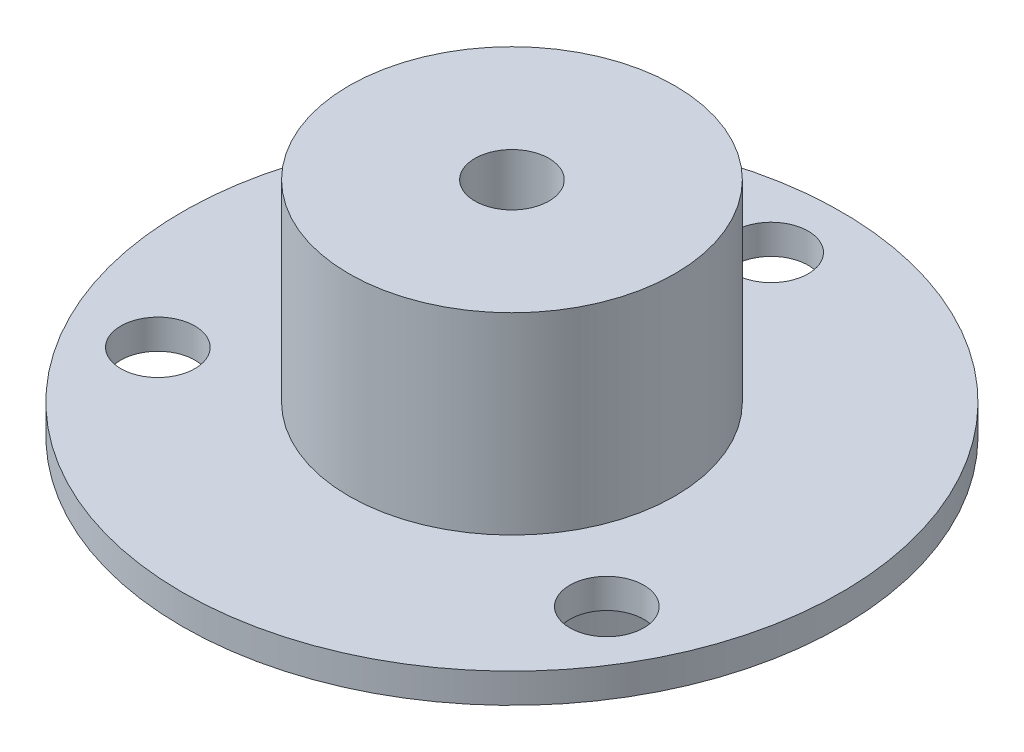
ISO-10303-21;
HEADER;
FILE_DESCRIPTION(('STEP AP214'),'2;1');
FILE_NAME('part.step','',(''),(''),'','','');
FILE_SCHEMA(('AUTOMOTIVE_DESIGN { 1 0 10303 214 1 1 1 1 }'));
ENDSEC;
DATA;
#1=APPLICATION_CONTEXT('core data for automotive mechanical design processes');
#2=APPLICATION_PROTOCOL_DEFINITION('international standard','automotive_design',2000,#1);
#3=PRODUCT_CONTEXT('',#1,'mechanical');
#4=PRODUCT('Part','Part','',(#3));
#5=PRODUCT_RELATED_PRODUCT_CATEGORY('part','',(#4));
#6=PRODUCT_DEFINITION_FORMATION('','',#4);
#7=PRODUCT_DEFINITION_CONTEXT('part definition',#1,'design');
#8=PRODUCT_DEFINITION('design','',#6,#7);
#9=PRODUCT_DEFINITION_SHAPE('','',#8);
#10=(LENGTH_UNIT() NAMED_UNIT(*) SI_UNIT(.MILLI.,.METRE.));
#11=(NAMED_UNIT(*) PLANE_ANGLE_UNIT() SI_UNIT($,.RADIAN.));
#12=(NAMED_UNIT(*) SI_UNIT($,.STERADIAN.) SOLID_ANGLE_UNIT());
#13=UNCERTAINTY_MEASURE_WITH_UNIT(LENGTH_MEASURE(1.E-05),#10,'distance_accuracy_value','');
#14=(GEOMETRIC_REPRESENTATION_CONTEXT(3) GLOBAL_UNCERTAINTY_ASSIGNED_CONTEXT((#13)) GLOBAL_UNIT_ASSIGNED_CONTEXT((#10,
#11,#12)) REPRESENTATION_CONTEXT('',''));
#15=CARTESIAN_POINT('',(0.,0.,0.));
#16=DIRECTION('',(0.,0.,1.));
#17=DIRECTION('',(1.,0.,0.));
#18=AXIS2_PLACEMENT_3D('',#15,#16,#17);
#19=CARTESIAN_POINT('',(0.,2.,0.));
#20=DIRECTION('',(0.,1.,0.));
#21=DIRECTION('',(0.,0.,1.));
#22=AXIS2_PLACEMENT_3D('',#19,#20,#21);
#23=PLANE('',#22);
#24=CARTESIAN_POINT('',(0.,2.,0.));
#25=DIRECTION('',(0.,1.,0.));
#26=DIRECTION('',(0.,0.,1.));
#27=AXIS2_PLACEMENT_3D('',#24,#25,#26);
#28=CIRCLE('',#27,11.);
#29=CARTESIAN_POINT('',(0.,2.,-11.));
#30=VERTEX_POINT('',#29);
#31=EDGE_CURVE('E52',#30,#30,#28,.T.);
#32=ORIENTED_EDGE('',*,*,#31,.F.);
#33=EDGE_LOOP('',(#32));
#34=FACE_BOUND('',#33,.T.);
#35=CARTESIAN_POINT('',(-15.1554445662276,2.,8.75000000000008));
#36=DIRECTION('',(0.,1.,0.));
#37=DIRECTION('',(0.,0.,1.));
#38=AXIS2_PLACEMENT_3D('',#35,#36,#37);
#39=CIRCLE('',#38,2.5);
#40=CARTESIAN_POINT('',(-15.1554445662276,2.,11.2500000000001));
#41=VERTEX_POINT('',#40);
#42=EDGE_CURVE('E65',#41,#41,#39,.T.);
#43=ORIENTED_EDGE('',*,*,#42,.F.);
#44=EDGE_LOOP('',(#43));
#45=FACE_BOUND('',#44,.T.);
#46=CARTESIAN_POINT('',(0.,2.,0.));
#47=DIRECTION('',(0.,1.,0.));
#48=DIRECTION('',(0.,0.,1.));
#49=AXIS2_PLACEMENT_3D('',#46,#47,#48);
#50=CIRCLE('',#49,22.25);
#51=CARTESIAN_POINT('',(0.,2.,22.25));
#52=VERTEX_POINT('',#51);
#53=EDGE_CURVE('E40',#52,#52,#50,.T.);
#54=ORIENTED_EDGE('',*,*,#53,.T.);
#55=EDGE_LOOP('',(#54));
#56=FACE_BOUND('',#55,.T.);
#57=CARTESIAN_POINT('',(0.,2.,-17.5));
#58=DIRECTION('',(0.,1.,0.));
#59=DIRECTION('',(0.,0.,1.));
#60=AXIS2_PLACEMENT_3D('',#57,#58,#59);
#61=CIRCLE('',#60,2.5);
#62=CARTESIAN_POINT('',(0.,2.,-15.));
#63=VERTEX_POINT('',#62);
#64=EDGE_CURVE('E71',#63,#63,#61,.T.);
#65=ORIENTED_EDGE('',*,*,#64,.F.);
#66=EDGE_LOOP('',(#65));
#67=FACE_BOUND('',#66,.T.);
#68=CARTESIAN_POINT('',(15.1554445662276,2.,8.75000000000008));
#69=DIRECTION('',(0.,1.,0.));
#70=DIRECTION('',(0.,0.,1.));
#71=AXIS2_PLACEMENT_3D('',#68,#69,#70);
#72=CIRCLE('',#71,2.5);
#73=CARTESIAN_POINT('',(15.1554445662276,2.,11.2500000000001));
#74=VERTEX_POINT('',#73);
#75=EDGE_CURVE('E59',#74,#74,#72,.T.);
#76=ORIENTED_EDGE('',*,*,#75,.F.);
#77=EDGE_LOOP('',(#76));
#78=FACE_BOUND('',#77,.T.);
#79=ADVANCED_FACE('F32',(#34,#45,#56,#67,#78),#23,.T.);
#80=CARTESIAN_POINT('',(0.,0.,0.));
#81=DIRECTION('',(0.,1.,0.));
#82=DIRECTION('',(0.,0.,1.));
#83=AXIS2_PLACEMENT_3D('',#80,#81,#82);
#84=PLANE('',#83);
#85=CARTESIAN_POINT('',(0.,0.,0.));
#86=DIRECTION('',(0.,-1.,0.));
#87=DIRECTION('',(0.,0.,-1.));
#88=AXIS2_PLACEMENT_3D('',#85,#86,#87);
#89=CIRCLE('',#88,11.);
#90=CARTESIAN_POINT('',(0.,0.,-11.));
#91=VERTEX_POINT('',#90);
#92=EDGE_CURVE('E10',#91,#91,#89,.T.);
#93=ORIENTED_EDGE('',*,*,#92,.F.);
#94=EDGE_LOOP('',(#93));
#95=FACE_BOUND('',#94,.T.);
#96=CARTESIAN_POINT('',(0.,0.,0.));
#97=DIRECTION('',(0.,1.,0.));
#98=DIRECTION('',(0.,0.,1.));
#99=AXIS2_PLACEMENT_3D('',#96,#97,#98);
#100=CIRCLE('',#99,22.25);
#101=CARTESIAN_POINT('',(0.,0.,22.25));
#102=VERTEX_POINT('',#101);
#103=EDGE_CURVE('E36',#102,#102,#100,.T.);
#104=ORIENTED_EDGE('',*,*,#103,.F.);
#105=EDGE_LOOP('',(#104));
#106=FACE_BOUND('',#105,.T.);
#107=CARTESIAN_POINT('',(0.,0.,-17.5));
#108=DIRECTION('',(0.,1.,0.));
#109=DIRECTION('',(0.,0.,1.));
#110=AXIS2_PLACEMENT_3D('',#107,#108,#109);
#111=CIRCLE('',#110,2.5);
#112=CARTESIAN_POINT('',(0.,0.,-15.));
#113=VERTEX_POINT('',#112);
#114=EDGE_CURVE('E68',#113,#113,#111,.T.);
#115=ORIENTED_EDGE('',*,*,#114,.T.);
#116=EDGE_LOOP('',(#115));
#117=FACE_BOUND('',#116,.T.);
#118=CARTESIAN_POINT('',(-15.1554445662276,0.,8.75000000000008));
#119=DIRECTION('',(0.,1.,0.));
#120=DIRECTION('',(0.,0.,1.));
#121=AXIS2_PLACEMENT_3D('',#118,#119,#120);
#122=CIRCLE('',#121,2.5);
#123=CARTESIAN_POINT('',(-15.1554445662276,0.,11.2500000000001));
#124=VERTEX_POINT('',#123);
#125=EDGE_CURVE('E62',#124,#124,#122,.T.);
#126=ORIENTED_EDGE('',*,*,#125,.T.);
#127=EDGE_LOOP('',(#126));
#128=FACE_BOUND('',#127,.T.);
#129=CARTESIAN_POINT('',(15.1554445662276,0.,8.75000000000008));
#130=DIRECTION('',(0.,1.,0.));
#131=DIRECTION('',(0.,0.,1.));
#132=AXIS2_PLACEMENT_3D('',#129,#130,#131);
#133=CIRCLE('',#132,2.5);
#134=CARTESIAN_POINT('',(15.1554445662276,0.,11.2500000000001));
#135=VERTEX_POINT('',#134);
#136=EDGE_CURVE('E56',#135,#135,#133,.T.);
#137=ORIENTED_EDGE('',*,*,#136,.T.);
#138=EDGE_LOOP('',(#137));
#139=FACE_BOUND('',#138,.T.);
#140=ADVANCED_FACE('F77',(#95,#106,#117,#128,#139),#84,.F.);
#141=CARTESIAN_POINT('',(0.,2.,0.));
#142=DIRECTION('',(0.,-1.,0.));
#143=DIRECTION('',(0.,0.,-1.));
#144=AXIS2_PLACEMENT_3D('',#141,#142,#143);
#145=CYLINDRICAL_SURFACE('',#144,22.25);
#146=ORIENTED_EDGE('',*,*,#53,.F.);
#147=EDGE_LOOP('',(#146));
#148=FACE_BOUND('',#147,.T.);
#149=ORIENTED_EDGE('',*,*,#103,.T.);
#150=EDGE_LOOP('',(#149));
#151=FACE_BOUND('',#150,.T.);
#152=ADVANCED_FACE('F34',(#148,#151),#145,.T.);
#153=CARTESIAN_POINT('',(0.,2.,-17.5));
#154=DIRECTION('',(0.,-1.,0.));
#155=DIRECTION('',(0.,0.,-1.));
#156=AXIS2_PLACEMENT_3D('',#153,#154,#155);
#157=CYLINDRICAL_SURFACE('',#156,2.5);
#158=ORIENTED_EDGE('',*,*,#64,.T.);
#159=EDGE_LOOP('',(#158));
#160=FACE_BOUND('',#159,.T.);
#161=ORIENTED_EDGE('',*,*,#114,.F.);
#162=EDGE_LOOP('',(#161));
#163=FACE_BOUND('',#162,.T.);
#164=ADVANCED_FACE('F80',(#160,#163),#157,.F.);
#165=CARTESIAN_POINT('',(-15.1554445662276,2.,8.75000000000008));
#166=DIRECTION('',(0.,-1.,0.));
#167=DIRECTION('',(0.,0.,-1.));
#168=AXIS2_PLACEMENT_3D('',#165,#166,#167);
#169=CYLINDRICAL_SURFACE('',#168,2.5);
#170=ORIENTED_EDGE('',*,*,#42,.T.);
#171=EDGE_LOOP('',(#170));
#172=FACE_BOUND('',#171,.T.);
#173=ORIENTED_EDGE('',*,*,#125,.F.);
#174=EDGE_LOOP('',(#173));
#175=FACE_BOUND('',#174,.T.);
#176=ADVANCED_FACE('F82',(#172,#175),#169,.F.);
#177=CARTESIAN_POINT('',(15.1554445662276,2.,8.75000000000008));
#178=DIRECTION('',(0.,-1.,0.));
#179=DIRECTION('',(0.,0.,-1.));
#180=AXIS2_PLACEMENT_3D('',#177,#178,#179);
#181=CYLINDRICAL_SURFACE('',#180,2.5);
#182=ORIENTED_EDGE('',*,*,#75,.T.);
#183=EDGE_LOOP('',(#182));
#184=FACE_BOUND('',#183,.T.);
#185=ORIENTED_EDGE('',*,*,#136,.F.);
#186=EDGE_LOOP('',(#185));
#187=FACE_BOUND('',#186,.T.);
#188=ADVANCED_FACE('F89',(#184,#187),#181,.F.);
#189=CARTESIAN_POINT('',(0.,15.,0.));
#190=DIRECTION('',(0.,1.,0.));
#191=DIRECTION('',(0.,0.,1.));
#192=AXIS2_PLACEMENT_3D('',#189,#190,#191);
#193=PLANE('',#192);
#194=CARTESIAN_POINT('',(0.,15.,0.));
#195=DIRECTION('',(0.,1.,0.));
#196=DIRECTION('',(0.,0.,1.));
#197=AXIS2_PLACEMENT_3D('',#194,#195,#196);
#198=CIRCLE('',#197,11.);
#199=CARTESIAN_POINT('',(0.,15.,-11.));
#200=VERTEX_POINT('',#199);
#201=EDGE_CURVE('E53',#200,#200,#198,.T.);
#202=ORIENTED_EDGE('',*,*,#201,.T.);
#203=EDGE_LOOP('',(#202));
#204=FACE_BOUND('',#203,.T.);
#205=CARTESIAN_POINT('',(0.,15.,0.));
#206=DIRECTION('',(0.,1.,0.));
#207=DIRECTION('',(0.,0.,1.));
#208=AXIS2_PLACEMENT_3D('',#205,#206,#207);
#209=CIRCLE('',#208,2.5);
#210=CARTESIAN_POINT('',(0.,15.,-2.5));
#211=VERTEX_POINT('',#210);
#212=EDGE_CURVE('E49',#211,#211,#209,.T.);
#213=ORIENTED_EDGE('',*,*,#212,.F.);
#214=EDGE_LOOP('',(#213));
#215=FACE_BOUND('',#214,.T.);
#216=ADVANCED_FACE('F112',(#204,#215),#193,.T.);
#217=CARTESIAN_POINT('',(0.,15.,0.));
#218=DIRECTION('',(0.,-1.,0.));
#219=DIRECTION('',(0.,0.,-1.));
#220=AXIS2_PLACEMENT_3D('',#217,#218,#219);
#221=CYLINDRICAL_SURFACE('',#220,11.);
#222=CARTESIAN_POINT('',(0.,15.,-11.));
#223=CARTESIAN_POINT('',(0.,14.8645833333333,-11.));
#224=CARTESIAN_POINT('',(0.,14.7291666666667,-11.));
#225=CARTESIAN_POINT('',(0.,14.4583333333333,-11.));
#226=CARTESIAN_POINT('',(0.,14.3229166666667,-11.));
#227=CARTESIAN_POINT('',(0.,14.0520833333333,-11.));
#228=CARTESIAN_POINT('',(0.,13.9166666666667,-11.));
#229=CARTESIAN_POINT('',(0.,13.6458333333333,-11.));
#230=CARTESIAN_POINT('',(0.,13.5104166666667,-11.));
#231=CARTESIAN_POINT('',(0.,13.2395833333333,-11.));
#232=CARTESIAN_POINT('',(0.,13.1041666666667,-11.));
#233=CARTESIAN_POINT('',(0.,12.8333333333333,-11.));
#234=CARTESIAN_POINT('',(0.,12.6979166666667,-11.));
#235=CARTESIAN_POINT('',(0.,12.4270833333333,-11.));
#236=CARTESIAN_POINT('',(0.,12.2916666666667,-11.));
#237=CARTESIAN_POINT('',(0.,12.0208333333333,-11.));
#238=CARTESIAN_POINT('',(0.,11.8854166666667,-11.));
#239=CARTESIAN_POINT('',(0.,11.6145833333333,-11.));
#240=CARTESIAN_POINT('',(0.,11.4791666666667,-11.));
#241=CARTESIAN_POINT('',(0.,11.2083333333333,-11.));
#242=CARTESIAN_POINT('',(0.,11.0729166666667,-11.));
#243=CARTESIAN_POINT('',(0.,10.8020833333333,-11.));
#244=CARTESIAN_POINT('',(0.,10.6666666666667,-11.));
#245=CARTESIAN_POINT('',(0.,10.3958333333333,-11.));
#246=CARTESIAN_POINT('',(0.,10.2604166666667,-11.));
#247=CARTESIAN_POINT('',(0.,9.98958333333333,-11.));
#248=CARTESIAN_POINT('',(0.,9.85416666666667,-11.));
#249=CARTESIAN_POINT('',(0.,9.58333333333333,-11.));
#250=CARTESIAN_POINT('',(0.,9.44791666666667,-11.));
#251=CARTESIAN_POINT('',(0.,9.17708333333333,-11.));
#252=CARTESIAN_POINT('',(0.,9.04166666666666,-11.));
#253=CARTESIAN_POINT('',(0.,8.77083333333333,-11.));
#254=CARTESIAN_POINT('',(0.,8.63541666666667,-11.));
#255=CARTESIAN_POINT('',(0.,8.36458333333333,-11.));
#256=CARTESIAN_POINT('',(0.,8.22916666666667,-11.));
#257=CARTESIAN_POINT('',(0.,7.95833333333333,-11.));
#258=CARTESIAN_POINT('',(0.,7.82291666666667,-11.));
#259=CARTESIAN_POINT('',(0.,7.55208333333333,-11.));
#260=CARTESIAN_POINT('',(0.,7.41666666666667,-11.));
#261=CARTESIAN_POINT('',(0.,7.14583333333333,-11.));
#262=CARTESIAN_POINT('',(0.,7.01041666666667,-11.));
#263=CARTESIAN_POINT('',(0.,6.73958333333333,-11.));
#264=CARTESIAN_POINT('',(0.,6.60416666666667,-11.));
#265=CARTESIAN_POINT('',(0.,6.33333333333333,-11.));
#266=CARTESIAN_POINT('',(0.,6.19791666666667,-11.));
#267=CARTESIAN_POINT('',(0.,5.92708333333333,-11.));
#268=CARTESIAN_POINT('',(0.,5.79166666666667,-11.));
#269=CARTESIAN_POINT('',(0.,5.52083333333333,-11.));
#270=CARTESIAN_POINT('',(0.,5.38541666666667,-11.));
#271=CARTESIAN_POINT('',(0.,5.11458333333333,-11.));
#272=CARTESIAN_POINT('',(0.,4.97916666666667,-11.));
#273=CARTESIAN_POINT('',(0.,4.70833333333333,-11.));
#274=CARTESIAN_POINT('',(0.,4.57291666666667,-11.));
#275=CARTESIAN_POINT('',(0.,4.30208333333333,-11.));
#276=CARTESIAN_POINT('',(0.,4.16666666666667,-11.));
#277=CARTESIAN_POINT('',(0.,3.89583333333333,-11.));
#278=CARTESIAN_POINT('',(0.,3.76041666666667,-11.));
#279=CARTESIAN_POINT('',(0.,3.48958333333333,-11.));
#280=CARTESIAN_POINT('',(0.,3.35416666666667,-11.));
#281=CARTESIAN_POINT('',(0.,3.08333333333333,-11.));
#282=CARTESIAN_POINT('',(0.,2.94791666666667,-11.));
#283=CARTESIAN_POINT('',(0.,2.67708333333333,-11.));
#284=CARTESIAN_POINT('',(0.,2.54166666666667,-11.));
#285=CARTESIAN_POINT('',(0.,2.27083333333333,-11.));
#286=CARTESIAN_POINT('',(0.,2.13541666666667,-11.));
#287=CARTESIAN_POINT('',(0.,2.,-11.));
#288=B_SPLINE_CURVE_WITH_KNOTS('',3,(#222,#223,#224,#225,#226,#227,#228,#229,#230,#231,#232,
#233,#234,#235,#236,#237,#238,#239,#240,#241,#242,#243,#244,#245,#246,#247,#248,#249,#250,#251,
#252,#253,#254,#255,#256,#257,#258,#259,#260,#261,#262,#263,#264,#265,#266,#267,#268,#269,#270,
#271,#272,#273,#274,#275,#276,#277,#278,#279,#280,#281,#282,#283,#284,#285,#286,#287),
.UNSPECIFIED.,.F.,.F.,(4,2,2,2,2,2,2,2,2,2,2,2,2,2,2,2,2,2,2,2,2,2,2,2,2,2,2,2,2,2,2,2,4),(0.,
0.40625,0.812500000000001,1.21875,1.625,2.03125,2.4375,2.84375,3.25,3.65625,4.0625,4.46875,
4.875,5.28125,5.6875,6.09375,6.5,6.90625,7.3125,7.71875,8.125,8.53125,8.9375,9.34375,9.75,
10.15625,10.5625,10.96875,11.375,11.78125,12.1875,12.59375,13.),.UNSPECIFIED.);
#289=EDGE_CURVE('BSEAM119',#200,#30,#288,.T.);
#290=ORIENTED_EDGE('',*,*,#201,.F.);
#291=ORIENTED_EDGE('',*,*,#31,.T.);
#292=ORIENTED_EDGE('',*,*,#289,.T.);
#293=ORIENTED_EDGE('',*,*,#289,.F.);
#294=EDGE_LOOP('',(#290,#292,#291,#293));
#295=FACE_BOUND('',#294,.T.);
#296=ADVANCED_FACE('F119',(#295),#221,.T.);
#297=CARTESIAN_POINT('',(0.,15.,0.));
#298=DIRECTION('',(0.,-1.,0.));
#299=DIRECTION('',(0.,0.,-1.));
#300=AXIS2_PLACEMENT_3D('',#297,#298,#299);
#301=CYLINDRICAL_SURFACE('',#300,2.5);
#302=CARTESIAN_POINT('',(0.,-6.,0.));
#303=DIRECTION('',(0.,-1.,0.));
#304=DIRECTION('',(0.,0.,-1.));
#305=AXIS2_PLACEMENT_3D('',#302,#303,#304);
#306=CIRCLE('',#305,2.5);
#307=CARTESIAN_POINT('',(0.,-6.,-2.5));
#308=VERTEX_POINT('',#307);
#309=EDGE_CURVE('E142',#308,#308,#306,.T.);
#310=CARTESIAN_POINT('',(0.,-6.,-2.5));
#311=CARTESIAN_POINT('',(0.,-5.78125,-2.5));
#312=CARTESIAN_POINT('',(0.,-5.5625,-2.5));
#313=CARTESIAN_POINT('',(0.,-5.125,-2.5));
#314=CARTESIAN_POINT('',(0.,-4.90625,-2.5));
#315=CARTESIAN_POINT('',(0.,-4.46875,-2.5));
#316=CARTESIAN_POINT('',(0.,-4.25,-2.5));
#317=CARTESIAN_POINT('',(0.,-3.8125,-2.5));
#318=CARTESIAN_POINT('',(0.,-3.59375,-2.5));
#319=CARTESIAN_POINT('',(0.,-3.15625,-2.5));
#320=CARTESIAN_POINT('',(0.,-2.9375,-2.5));
#321=CARTESIAN_POINT('',(0.,-2.5,-2.5));
#322=CARTESIAN_POINT('',(0.,-2.28125,-2.5));
#323=CARTESIAN_POINT('',(0.,-1.84375,-2.5));
#324=CARTESIAN_POINT('',(0.,-1.625,-2.5));
#325=CARTESIAN_POINT('',(0.,-1.1875,-2.5));
#326=CARTESIAN_POINT('',(0.,-0.968750000000001,-2.5));
#327=CARTESIAN_POINT('',(0.,-0.531250000000001,-2.5));
#328=CARTESIAN_POINT('',(0.,-0.312500000000001,-2.5));
#329=CARTESIAN_POINT('',(0.,0.124999999999998,-2.5));
#330=CARTESIAN_POINT('',(0.,0.343749999999999,-2.5));
#331=CARTESIAN_POINT('',(0.,0.781249999999998,-2.5));
#332=CARTESIAN_POINT('',(0.,0.999999999999998,-2.5));
#333=CARTESIAN_POINT('',(0.,1.4375,-2.5));
#334=CARTESIAN_POINT('',(0.,1.65625,-2.5));
#335=CARTESIAN_POINT('',(0.,2.09375,-2.5));
#336=CARTESIAN_POINT('',(0.,2.3125,-2.5));
#337=CARTESIAN_POINT('',(0.,2.75,-2.5));
#338=CARTESIAN_POINT('',(0.,2.96875,-2.5));
#339=CARTESIAN_POINT('',(0.,3.40625,-2.5));
#340=CARTESIAN_POINT('',(0.,3.625,-2.5));
#341=CARTESIAN_POINT('',(0.,4.0625,-2.5));
#342=CARTESIAN_POINT('',(0.,4.28125,-2.5));
#343=CARTESIAN_POINT('',(0.,4.71875,-2.5));
#344=CARTESIAN_POINT('',(0.,4.9375,-2.5));
#345=CARTESIAN_POINT('',(0.,5.375,-2.5));
#346=CARTESIAN_POINT('',(0.,5.59375,-2.5));
#347=CARTESIAN_POINT('',(0.,6.03125,-2.5));
#348=CARTESIAN_POINT('',(0.,6.25,-2.5));
#349=CARTESIAN_POINT('',(0.,6.6875,-2.5));
#350=CARTESIAN_POINT('',(0.,6.90625,-2.5));
#351=CARTESIAN_POINT('',(0.,7.34375,-2.5));
#352=CARTESIAN_POINT('',(0.,7.5625,-2.5));
#353=CARTESIAN_POINT('',(0.,8.,-2.5));
#354=CARTESIAN_POINT('',(0.,8.21875,-2.5));
#355=CARTESIAN_POINT('',(0.,8.65625,-2.5));
#356=CARTESIAN_POINT('',(0.,8.875,-2.5));
#357=CARTESIAN_POINT('',(0.,9.3125,-2.5));
#358=CARTESIAN_POINT('',(0.,9.53125,-2.5));
#359=CARTESIAN_POINT('',(0.,9.96875,-2.5));
#360=CARTESIAN_POINT('',(0.,10.1875,-2.5));
#361=CARTESIAN_POINT('',(0.,10.625,-2.5));
#362=CARTESIAN_POINT('',(0.,10.84375,-2.5));
#363=CARTESIAN_POINT('',(0.,11.28125,-2.5));
#364=CARTESIAN_POINT('',(0.,11.5,-2.5));
#365=CARTESIAN_POINT('',(0.,11.9375,-2.5));
#366=CARTESIAN_POINT('',(0.,12.15625,-2.5));
#367=CARTESIAN_POINT('',(0.,12.59375,-2.5));
#368=CARTESIAN_POINT('',(0.,12.8125,-2.5));
#369=CARTESIAN_POINT('',(0.,13.25,-2.5));
#370=CARTESIAN_POINT('',(0.,13.46875,-2.5));
#371=CARTESIAN_POINT('',(0.,13.90625,-2.5));
#372=CARTESIAN_POINT('',(0.,14.125,-2.5));
#373=CARTESIAN_POINT('',(0.,14.5625,-2.5));
#374=CARTESIAN_POINT('',(0.,14.78125,-2.5));
#375=CARTESIAN_POINT('',(0.,15.,-2.5));
#376=B_SPLINE_CURVE_WITH_KNOTS('',3,(#310,#311,#312,#313,#314,#315,#316,#317,#318,#319,#320,
#321,#322,#323,#324,#325,#326,#327,#328,#329,#330,#331,#332,#333,#334,#335,#336,#337,#338,#339,
#340,#341,#342,#343,#344,#345,#346,#347,#348,#349,#350,#351,#352,#353,#354,#355,#356,#357,#358,
#359,#360,#361,#362,#363,#364,#365,#366,#367,#368,#369,#370,#371,#372,#373,#374,#375),
.UNSPECIFIED.,.F.,.F.,(4,2,2,2,2,2,2,2,2,2,2,2,2,2,2,2,2,2,2,2,2,2,2,2,2,2,2,2,2,2,2,2,4),(0.,
0.656250000000001,1.3125,1.96875,2.625,3.28125,3.9375,4.59375,5.25,5.90625,6.5625,7.21875,7.875,
8.53125,9.1875,9.84375,10.5,11.15625,11.8125,12.46875,13.125,13.78125,14.4375,15.09375,15.75,
16.40625,17.0625,17.71875,18.375,19.03125,19.6875,20.34375,21.),.UNSPECIFIED.);
#377=EDGE_CURVE('BSEAM124',#308,#211,#376,.T.);
#378=ORIENTED_EDGE('',*,*,#309,.T.);
#379=ORIENTED_EDGE('',*,*,#212,.T.);
#380=ORIENTED_EDGE('',*,*,#377,.T.);
#381=ORIENTED_EDGE('',*,*,#377,.F.);
#382=EDGE_LOOP('',(#378,#380,#379,#381));
#383=FACE_BOUND('',#382,.T.);
#384=ADVANCED_FACE('F124',(#383),#301,.F.);
#385=CARTESIAN_POINT('',(0.,-6.,0.));
#386=DIRECTION('',(0.,1.,0.));
#387=DIRECTION('',(0.,0.,1.));
#388=AXIS2_PLACEMENT_3D('',#385,#386,#387);
#389=CYLINDRICAL_SURFACE('',#388,11.);
#390=CARTESIAN_POINT('',(0.,-6.,0.));
#391=DIRECTION('',(0.,-1.,0.));
#392=DIRECTION('',(0.,0.,-1.));
#393=AXIS2_PLACEMENT_3D('',#390,#391,#392);
#394=CIRCLE('',#393,11.);
#395=CARTESIAN_POINT('',(0.,-6.,-11.));
#396=VERTEX_POINT('',#395);
#397=EDGE_CURVE('E47',#396,#396,#394,.T.);
#398=ORIENTED_EDGE('',*,*,#397,.F.);
#399=EDGE_LOOP('',(#398));
#400=FACE_BOUND('',#399,.T.);
#401=ORIENTED_EDGE('',*,*,#92,.T.);
#402=EDGE_LOOP('',(#401));
#403=FACE_BOUND('',#402,.T.);
#404=ADVANCED_FACE('F129',(#400,#403),#389,.T.);
#405=CARTESIAN_POINT('',(0.,-6.,0.));
#406=DIRECTION('',(0.,-1.,0.));
#407=DIRECTION('',(0.,0.,-1.));
#408=AXIS2_PLACEMENT_3D('',#405,#406,#407);
#409=PLANE('',#408);
#410=ORIENTED_EDGE('',*,*,#309,.F.);
#411=EDGE_LOOP('',(#410));
#412=FACE_BOUND('',#411,.T.);
#413=ORIENTED_EDGE('',*,*,#397,.T.);
#414=EDGE_LOOP('',(#413));
#415=FACE_BOUND('',#414,.T.);
#416=ADVANCED_FACE('F133',(#412,#415),#409,.T.);
#417=CLOSED_SHELL('',(#79,#140,#152,#164,#176,#188,#216,#296,#384,#404,#416));
#418=MANIFOLD_SOLID_BREP('B2',#417);
#419=ADVANCED_BREP_SHAPE_REPRESENTATION('',(#18,#418),#14);
#420=SHAPE_DEFINITION_REPRESENTATION(#9,#419);
ENDSEC;
END-ISO-10303-21;
